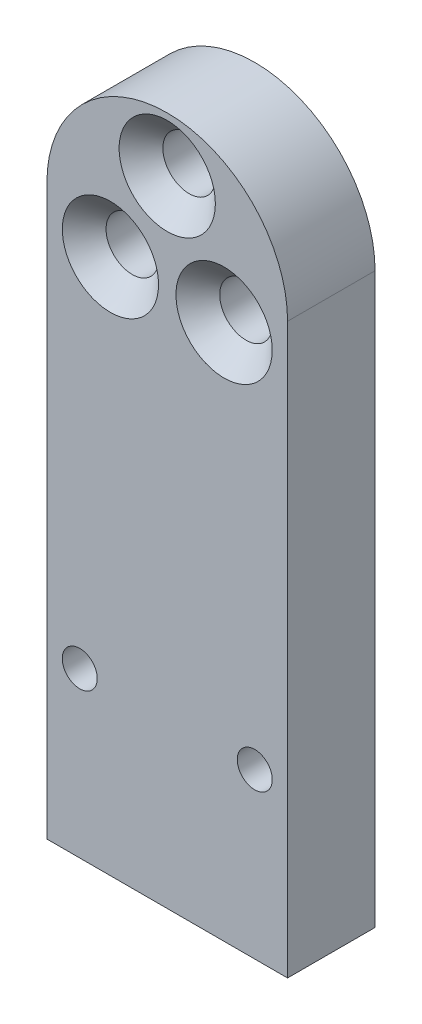
ISO-10303-21;
HEADER;
FILE_DESCRIPTION(('STEP AP214'),'2;1');
FILE_NAME('part.step','',(''),(''),'','','');
FILE_SCHEMA(('AUTOMOTIVE_DESIGN { 1 0 10303 214 1 1 1 1 }'));
ENDSEC;
DATA;
#1=APPLICATION_CONTEXT('core data for automotive mechanical design processes');
#2=APPLICATION_PROTOCOL_DEFINITION('international standard','automotive_design',2000,#1);
#3=PRODUCT_CONTEXT('',#1,'mechanical');
#4=PRODUCT('Part','Part','',(#3));
#5=PRODUCT_RELATED_PRODUCT_CATEGORY('part','',(#4));
#6=PRODUCT_DEFINITION_FORMATION('','',#4);
#7=PRODUCT_DEFINITION_CONTEXT('part definition',#1,'design');
#8=PRODUCT_DEFINITION('design','',#6,#7);
#9=PRODUCT_DEFINITION_SHAPE('','',#8);
#10=(LENGTH_UNIT() NAMED_UNIT(*) SI_UNIT(.MILLI.,.METRE.));
#11=(NAMED_UNIT(*) PLANE_ANGLE_UNIT() SI_UNIT($,.RADIAN.));
#12=(NAMED_UNIT(*) SI_UNIT($,.STERADIAN.) SOLID_ANGLE_UNIT());
#13=UNCERTAINTY_MEASURE_WITH_UNIT(LENGTH_MEASURE(1.E-05),#10,'distance_accuracy_value','');
#14=(GEOMETRIC_REPRESENTATION_CONTEXT(3) GLOBAL_UNCERTAINTY_ASSIGNED_CONTEXT((#13)) GLOBAL_UNIT_ASSIGNED_CONTEXT((#10,
#11,#12)) REPRESENTATION_CONTEXT('',''));
#15=CARTESIAN_POINT('',(0.,0.,0.));
#16=DIRECTION('',(0.,0.,1.));
#17=DIRECTION('',(1.,0.,0.));
#18=AXIS2_PLACEMENT_3D('',#15,#16,#17);
#19=CARTESIAN_POINT('',(0.,0.,4.));
#20=DIRECTION('',(0.,0.,-1.));
#21=DIRECTION('',(-1.,0.,0.));
#22=AXIS2_PLACEMENT_3D('',#19,#20,#21);
#23=CYLINDRICAL_SURFACE('',#22,5.5);
#24=CARTESIAN_POINT('',(0.,0.,0.));
#25=DIRECTION('',(0.,0.,1.));
#26=DIRECTION('',(1.,0.,0.));
#27=AXIS2_PLACEMENT_3D('',#24,#25,#26);
#28=CIRCLE('',#27,5.5);
#29=CARTESIAN_POINT('',(5.5,0.,0.));
#30=VERTEX_POINT('',#29);
#31=CARTESIAN_POINT('',(-5.5,0.,0.));
#32=VERTEX_POINT('',#31);
#33=EDGE_CURVE('E111',#30,#32,#28,.T.);
#34=ORIENTED_EDGE('',*,*,#33,.T.);
#35=DIRECTION('',(0.,0.,-1.));
#36=VECTOR('',#35,1.);
#37=CARTESIAN_POINT('',(-5.5,0.,4.));
#38=LINE('',#37,#36);
#39=CARTESIAN_POINT('',(-5.5,0.,4.));
#40=VERTEX_POINT('',#39);
#41=EDGE_CURVE('E11',#40,#32,#38,.T.);
#42=ORIENTED_EDGE('',*,*,#41,.F.);
#43=CARTESIAN_POINT('',(0.,0.,4.));
#44=DIRECTION('',(0.,0.,1.));
#45=DIRECTION('',(1.,0.,0.));
#46=AXIS2_PLACEMENT_3D('',#43,#44,#45);
#47=CIRCLE('',#46,5.5);
#48=CARTESIAN_POINT('',(5.5,0.,4.));
#49=VERTEX_POINT('',#48);
#50=EDGE_CURVE('E95',#49,#40,#47,.T.);
#51=ORIENTED_EDGE('',*,*,#50,.F.);
#52=DIRECTION('',(0.,0.,-1.));
#53=VECTOR('',#52,1.);
#54=CARTESIAN_POINT('',(5.5,0.,4.));
#55=LINE('',#54,#53);
#56=EDGE_CURVE('E107',#49,#30,#55,.T.);
#57=ORIENTED_EDGE('',*,*,#56,.T.);
#58=EDGE_LOOP('',(#34,#42,#51,#57));
#59=FACE_BOUND('',#58,.T.);
#60=ADVANCED_FACE('F43',(#59),#23,.T.);
#61=CARTESIAN_POINT('',(-5.5,0.,4.));
#62=DIRECTION('',(1.,0.,0.));
#63=DIRECTION('',(0.,1.,0.));
#64=AXIS2_PLACEMENT_3D('',#61,#62,#63);
#65=PLANE('',#64);
#66=DIRECTION('',(0.,-1.,0.));
#67=VECTOR('',#66,1.);
#68=CARTESIAN_POINT('',(-5.5,0.,0.));
#69=LINE('',#68,#67);
#70=CARTESIAN_POINT('',(-5.5,-26.,0.));
#71=VERTEX_POINT('',#70);
#72=EDGE_CURVE('E100',#32,#71,#69,.T.);
#73=ORIENTED_EDGE('',*,*,#72,.T.);
#74=DIRECTION('',(0.,0.,-1.));
#75=VECTOR('',#74,1.);
#76=CARTESIAN_POINT('',(-5.5,-26.,4.));
#77=LINE('',#76,#75);
#78=CARTESIAN_POINT('',(-5.5,-26.,4.));
#79=VERTEX_POINT('',#78);
#80=EDGE_CURVE('E52',#79,#71,#77,.T.);
#81=ORIENTED_EDGE('',*,*,#80,.F.);
#82=DIRECTION('',(0.,-1.,0.));
#83=VECTOR('',#82,1.);
#84=CARTESIAN_POINT('',(-5.5,0.,4.));
#85=LINE('',#84,#83);
#86=EDGE_CURVE('E90',#40,#79,#85,.T.);
#87=ORIENTED_EDGE('',*,*,#86,.F.);
#88=ORIENTED_EDGE('',*,*,#41,.T.);
#89=EDGE_LOOP('',(#73,#81,#87,#88));
#90=FACE_BOUND('',#89,.T.);
#91=ADVANCED_FACE('F99',(#90),#65,.F.);
#92=CARTESIAN_POINT('',(5.5,-26.,4.));
#93=DIRECTION('',(0.,1.,0.));
#94=DIRECTION('',(0.,0.,1.));
#95=AXIS2_PLACEMENT_3D('',#92,#93,#94);
#96=PLANE('',#95);
#97=DIRECTION('',(1.,0.,0.));
#98=VECTOR('',#97,1.);
#99=CARTESIAN_POINT('',(5.5,-26.,0.));
#100=LINE('',#99,#98);
#101=CARTESIAN_POINT('',(5.5,-26.,0.));
#102=VERTEX_POINT('',#101);
#103=EDGE_CURVE('E77',#71,#102,#100,.T.);
#104=ORIENTED_EDGE('',*,*,#103,.T.);
#105=DIRECTION('',(0.,0.,-1.));
#106=VECTOR('',#105,1.);
#107=CARTESIAN_POINT('',(5.5,-26.,4.));
#108=LINE('',#107,#106);
#109=CARTESIAN_POINT('',(5.5,-26.,4.));
#110=VERTEX_POINT('',#109);
#111=EDGE_CURVE('E102',#110,#102,#108,.T.);
#112=ORIENTED_EDGE('',*,*,#111,.F.);
#113=DIRECTION('',(1.,0.,0.));
#114=VECTOR('',#113,1.);
#115=CARTESIAN_POINT('',(5.5,-26.,4.));
#116=LINE('',#115,#114);
#117=EDGE_CURVE('E93',#79,#110,#116,.T.);
#118=ORIENTED_EDGE('',*,*,#117,.F.);
#119=ORIENTED_EDGE('',*,*,#80,.T.);
#120=EDGE_LOOP('',(#104,#112,#118,#119));
#121=FACE_BOUND('',#120,.T.);
#122=ADVANCED_FACE('F103',(#121),#96,.F.);
#123=CARTESIAN_POINT('',(5.5,0.,4.));
#124=DIRECTION('',(-1.,0.,0.));
#125=DIRECTION('',(0.,-1.,0.));
#126=AXIS2_PLACEMENT_3D('',#123,#124,#125);
#127=PLANE('',#126);
#128=DIRECTION('',(0.,1.,0.));
#129=VECTOR('',#128,1.);
#130=CARTESIAN_POINT('',(5.5,0.,0.));
#131=LINE('',#130,#129);
#132=EDGE_CURVE('E83',#102,#30,#131,.T.);
#133=ORIENTED_EDGE('',*,*,#132,.T.);
#134=ORIENTED_EDGE('',*,*,#56,.F.);
#135=DIRECTION('',(0.,1.,0.));
#136=VECTOR('',#135,1.);
#137=CARTESIAN_POINT('',(5.5,0.,4.));
#138=LINE('',#137,#136);
#139=EDGE_CURVE('E60',#110,#49,#138,.T.);
#140=ORIENTED_EDGE('',*,*,#139,.F.);
#141=ORIENTED_EDGE('',*,*,#111,.T.);
#142=EDGE_LOOP('',(#133,#134,#140,#141));
#143=FACE_BOUND('',#142,.T.);
#144=ADVANCED_FACE('F125',(#143),#127,.F.);
#145=CARTESIAN_POINT('',(0.,0.,4.));
#146=DIRECTION('',(0.,0.,1.));
#147=DIRECTION('',(1.,0.,0.));
#148=AXIS2_PLACEMENT_3D('',#145,#146,#147);
#149=PLANE('',#148);
#150=CARTESIAN_POINT('',(2.59807621135333,-1.49999999999998,4.));
#151=DIRECTION('',(0.,0.,1.));
#152=DIRECTION('',(1.,0.,0.));
#153=AXIS2_PLACEMENT_3D('',#150,#151,#152);
#154=CIRCLE('',#153,2.2);
#155=CARTESIAN_POINT('',(4.79807621135333,-1.49999999999998,4.));
#156=VERTEX_POINT('',#155);
#157=EDGE_CURVE('E179',#156,#156,#154,.T.);
#158=ORIENTED_EDGE('',*,*,#157,.F.);
#159=EDGE_LOOP('',(#158));
#160=FACE_BOUND('',#159,.T.);
#161=CARTESIAN_POINT('',(-2.59807621135331,-1.50000000000001,4.));
#162=DIRECTION('',(0.,0.,1.));
#163=DIRECTION('',(1.,0.,0.));
#164=AXIS2_PLACEMENT_3D('',#161,#162,#163);
#165=CIRCLE('',#164,2.2);
#166=CARTESIAN_POINT('',(-0.398076211353309,-1.50000000000001,4.));
#167=VERTEX_POINT('',#166);
#168=EDGE_CURVE('E167',#167,#167,#165,.T.);
#169=ORIENTED_EDGE('',*,*,#168,.F.);
#170=EDGE_LOOP('',(#169));
#171=FACE_BOUND('',#170,.T.);
#172=CARTESIAN_POINT('',(0.,3.,4.));
#173=DIRECTION('',(0.,0.,1.));
#174=DIRECTION('',(1.,0.,0.));
#175=AXIS2_PLACEMENT_3D('',#172,#173,#174);
#176=CIRCLE('',#175,2.2);
#177=CARTESIAN_POINT('',(2.2,3.,4.));
#178=VERTEX_POINT('',#177);
#179=EDGE_CURVE('E155',#178,#178,#176,.T.);
#180=ORIENTED_EDGE('',*,*,#179,.F.);
#181=EDGE_LOOP('',(#180));
#182=FACE_BOUND('',#181,.T.);
#183=CARTESIAN_POINT('',(-4.,-18.5,4.));
#184=DIRECTION('',(0.,0.,1.));
#185=DIRECTION('',(1.,0.,0.));
#186=AXIS2_PLACEMENT_3D('',#183,#184,#185);
#187=CIRCLE('',#186,0.799999999999999);
#188=CARTESIAN_POINT('',(-3.2,-18.5,4.));
#189=VERTEX_POINT('',#188);
#190=EDGE_CURVE('E143',#189,#189,#187,.T.);
#191=ORIENTED_EDGE('',*,*,#190,.F.);
#192=EDGE_LOOP('',(#191));
#193=FACE_BOUND('',#192,.T.);
#194=CARTESIAN_POINT('',(4.,-18.5,4.));
#195=DIRECTION('',(0.,0.,1.));
#196=DIRECTION('',(1.,0.,0.));
#197=AXIS2_PLACEMENT_3D('',#194,#195,#196);
#198=CIRCLE('',#197,0.799999999999999);
#199=CARTESIAN_POINT('',(4.8,-18.5,4.));
#200=VERTEX_POINT('',#199);
#201=EDGE_CURVE('E135',#200,#200,#198,.T.);
#202=ORIENTED_EDGE('',*,*,#201,.F.);
#203=EDGE_LOOP('',(#202));
#204=FACE_BOUND('',#203,.T.);
#205=ORIENTED_EDGE('',*,*,#50,.T.);
#206=ORIENTED_EDGE('',*,*,#86,.T.);
#207=ORIENTED_EDGE('',*,*,#117,.T.);
#208=ORIENTED_EDGE('',*,*,#139,.T.);
#209=EDGE_LOOP('',(#205,#206,#207,#208));
#210=FACE_BOUND('',#209,.T.);
#211=ADVANCED_FACE('F91',(#160,#171,#182,#193,#204,#210),#149,.T.);
#212=CARTESIAN_POINT('',(0.,0.,0.));
#213=DIRECTION('',(0.,0.,1.));
#214=DIRECTION('',(1.,0.,0.));
#215=AXIS2_PLACEMENT_3D('',#212,#213,#214);
#216=PLANE('',#215);
#217=CARTESIAN_POINT('',(2.59807621135333,-1.49999999999998,0.));
#218=DIRECTION('',(0.,0.,1.));
#219=DIRECTION('',(1.,0.,0.));
#220=AXIS2_PLACEMENT_3D('',#217,#218,#219);
#221=CIRCLE('',#220,1.2);
#222=CARTESIAN_POINT('',(3.79807621135333,-1.49999999999998,0.));
#223=VERTEX_POINT('',#222);
#224=EDGE_CURVE('E171',#223,#223,#221,.T.);
#225=ORIENTED_EDGE('',*,*,#224,.T.);
#226=EDGE_LOOP('',(#225));
#227=FACE_BOUND('',#226,.T.);
#228=CARTESIAN_POINT('',(-2.59807621135331,-1.50000000000001,0.));
#229=DIRECTION('',(0.,0.,1.));
#230=DIRECTION('',(1.,0.,0.));
#231=AXIS2_PLACEMENT_3D('',#228,#229,#230);
#232=CIRCLE('',#231,1.2);
#233=CARTESIAN_POINT('',(-1.39807621135331,-1.50000000000001,0.));
#234=VERTEX_POINT('',#233);
#235=EDGE_CURVE('E159',#234,#234,#232,.T.);
#236=ORIENTED_EDGE('',*,*,#235,.T.);
#237=EDGE_LOOP('',(#236));
#238=FACE_BOUND('',#237,.T.);
#239=CARTESIAN_POINT('',(0.,3.,0.));
#240=DIRECTION('',(0.,0.,1.));
#241=DIRECTION('',(1.,0.,0.));
#242=AXIS2_PLACEMENT_3D('',#239,#240,#241);
#243=CIRCLE('',#242,1.2);
#244=CARTESIAN_POINT('',(1.2,3.,0.));
#245=VERTEX_POINT('',#244);
#246=EDGE_CURVE('E147',#245,#245,#243,.T.);
#247=ORIENTED_EDGE('',*,*,#246,.T.);
#248=EDGE_LOOP('',(#247));
#249=FACE_BOUND('',#248,.T.);
#250=CARTESIAN_POINT('',(-4.,-18.5,0.));
#251=DIRECTION('',(0.,0.,1.));
#252=DIRECTION('',(1.,0.,0.));
#253=AXIS2_PLACEMENT_3D('',#250,#251,#252);
#254=CIRCLE('',#253,0.799999999999999);
#255=CARTESIAN_POINT('',(-3.2,-18.5,0.));
#256=VERTEX_POINT('',#255);
#257=EDGE_CURVE('E139',#256,#256,#254,.T.);
#258=ORIENTED_EDGE('',*,*,#257,.T.);
#259=EDGE_LOOP('',(#258));
#260=FACE_BOUND('',#259,.T.);
#261=CARTESIAN_POINT('',(4.,-18.5,0.));
#262=DIRECTION('',(0.,0.,1.));
#263=DIRECTION('',(1.,0.,0.));
#264=AXIS2_PLACEMENT_3D('',#261,#262,#263);
#265=CIRCLE('',#264,0.799999999999999);
#266=CARTESIAN_POINT('',(4.8,-18.5,0.));
#267=VERTEX_POINT('',#266);
#268=EDGE_CURVE('E115',#267,#267,#265,.T.);
#269=ORIENTED_EDGE('',*,*,#268,.T.);
#270=EDGE_LOOP('',(#269));
#271=FACE_BOUND('',#270,.T.);
#272=ORIENTED_EDGE('',*,*,#33,.F.);
#273=ORIENTED_EDGE('',*,*,#132,.F.);
#274=ORIENTED_EDGE('',*,*,#103,.F.);
#275=ORIENTED_EDGE('',*,*,#72,.F.);
#276=EDGE_LOOP('',(#272,#273,#274,#275));
#277=FACE_BOUND('',#276,.T.);
#278=ADVANCED_FACE('F128',(#227,#238,#249,#260,#271,#277),#216,.F.);
#279=CARTESIAN_POINT('',(4.,-18.5,4.));
#280=DIRECTION('',(0.,0.,1.));
#281=DIRECTION('',(1.,0.,0.));
#282=AXIS2_PLACEMENT_3D('',#279,#280,#281);
#283=CYLINDRICAL_SURFACE('',#282,0.799999999999999);
#284=ORIENTED_EDGE('',*,*,#268,.F.);
#285=EDGE_LOOP('',(#284));
#286=FACE_BOUND('',#285,.T.);
#287=ORIENTED_EDGE('',*,*,#201,.T.);
#288=EDGE_LOOP('',(#287));
#289=FACE_BOUND('',#288,.T.);
#290=ADVANCED_FACE('F197',(#286,#289),#283,.F.);
#291=CARTESIAN_POINT('',(-4.,-18.5,4.));
#292=DIRECTION('',(0.,0.,1.));
#293=DIRECTION('',(1.,0.,0.));
#294=AXIS2_PLACEMENT_3D('',#291,#292,#293);
#295=CYLINDRICAL_SURFACE('',#294,0.799999999999999);
#296=ORIENTED_EDGE('',*,*,#257,.F.);
#297=EDGE_LOOP('',(#296));
#298=FACE_BOUND('',#297,.T.);
#299=ORIENTED_EDGE('',*,*,#190,.T.);
#300=EDGE_LOOP('',(#299));
#301=FACE_BOUND('',#300,.T.);
#302=ADVANCED_FACE('F199',(#298,#301),#295,.F.);
#303=CARTESIAN_POINT('',(0.,3.,4.));
#304=DIRECTION('',(0.,0.,1.));
#305=DIRECTION('',(1.,0.,0.));
#306=AXIS2_PLACEMENT_3D('',#303,#304,#305);
#307=CYLINDRICAL_SURFACE('',#306,1.2);
#308=ORIENTED_EDGE('',*,*,#246,.F.);
#309=EDGE_LOOP('',(#308));
#310=FACE_BOUND('',#309,.T.);
#311=CARTESIAN_POINT('',(0.,3.,3.));
#312=DIRECTION('',(0.,0.,1.));
#313=DIRECTION('',(1.,0.,0.));
#314=AXIS2_PLACEMENT_3D('',#311,#312,#313);
#315=CIRCLE('',#314,1.2);
#316=CARTESIAN_POINT('',(1.2,3.,3.));
#317=VERTEX_POINT('',#316);
#318=EDGE_CURVE('E151',#317,#317,#315,.T.);
#319=ORIENTED_EDGE('',*,*,#318,.T.);
#320=EDGE_LOOP('',(#319));
#321=FACE_BOUND('',#320,.T.);
#322=ADVANCED_FACE('F206',(#310,#321),#307,.F.);
#323=CARTESIAN_POINT('',(0.,3.,4.));
#324=DIRECTION('',(0.,0.,1.));
#325=DIRECTION('',(1.,0.,0.));
#326=AXIS2_PLACEMENT_3D('',#323,#324,#325);
#327=CONICAL_SURFACE('',#326,2.2,0.785398163397448);
#328=ORIENTED_EDGE('',*,*,#318,.F.);
#329=EDGE_LOOP('',(#328));
#330=FACE_BOUND('',#329,.T.);
#331=ORIENTED_EDGE('',*,*,#179,.T.);
#332=EDGE_LOOP('',(#331));
#333=FACE_BOUND('',#332,.T.);
#334=ADVANCED_FACE('F249',(#330,#333),#327,.F.);
#335=CARTESIAN_POINT('',(-2.59807621135331,-1.50000000000001,4.));
#336=DIRECTION('',(0.,0.,1.));
#337=DIRECTION('',(1.,0.,0.));
#338=AXIS2_PLACEMENT_3D('',#335,#336,#337);
#339=CYLINDRICAL_SURFACE('',#338,1.2);
#340=ORIENTED_EDGE('',*,*,#235,.F.);
#341=EDGE_LOOP('',(#340));
#342=FACE_BOUND('',#341,.T.);
#343=CARTESIAN_POINT('',(-2.59807621135331,-1.50000000000001,3.));
#344=DIRECTION('',(0.,0.,1.));
#345=DIRECTION('',(1.,0.,0.));
#346=AXIS2_PLACEMENT_3D('',#343,#344,#345);
#347=CIRCLE('',#346,1.2);
#348=CARTESIAN_POINT('',(-1.39807621135331,-1.50000000000001,3.));
#349=VERTEX_POINT('',#348);
#350=EDGE_CURVE('E163',#349,#349,#347,.T.);
#351=ORIENTED_EDGE('',*,*,#350,.T.);
#352=EDGE_LOOP('',(#351));
#353=FACE_BOUND('',#352,.T.);
#354=ADVANCED_FACE('F243',(#342,#353),#339,.F.);
#355=CARTESIAN_POINT('',(-2.59807621135331,-1.50000000000001,4.));
#356=DIRECTION('',(0.,0.,1.));
#357=DIRECTION('',(1.,0.,0.));
#358=AXIS2_PLACEMENT_3D('',#355,#356,#357);
#359=CONICAL_SURFACE('',#358,2.2,0.785398163397448);
#360=ORIENTED_EDGE('',*,*,#350,.F.);
#361=EDGE_LOOP('',(#360));
#362=FACE_BOUND('',#361,.T.);
#363=ORIENTED_EDGE('',*,*,#168,.T.);
#364=EDGE_LOOP('',(#363));
#365=FACE_BOUND('',#364,.T.);
#366=ADVANCED_FACE('F248',(#362,#365),#359,.F.);
#367=CARTESIAN_POINT('',(2.59807621135333,-1.49999999999998,4.));
#368=DIRECTION('',(0.,0.,1.));
#369=DIRECTION('',(1.,0.,0.));
#370=AXIS2_PLACEMENT_3D('',#367,#368,#369);
#371=CYLINDRICAL_SURFACE('',#370,1.2);
#372=ORIENTED_EDGE('',*,*,#224,.F.);
#373=EDGE_LOOP('',(#372));
#374=FACE_BOUND('',#373,.T.);
#375=CARTESIAN_POINT('',(2.59807621135333,-1.49999999999998,3.));
#376=DIRECTION('',(0.,0.,1.));
#377=DIRECTION('',(1.,0.,0.));
#378=AXIS2_PLACEMENT_3D('',#375,#376,#377);
#379=CIRCLE('',#378,1.2);
#380=CARTESIAN_POINT('',(3.79807621135333,-1.49999999999998,3.));
#381=VERTEX_POINT('',#380);
#382=EDGE_CURVE('E175',#381,#381,#379,.T.);
#383=ORIENTED_EDGE('',*,*,#382,.T.);
#384=EDGE_LOOP('',(#383));
#385=FACE_BOUND('',#384,.T.);
#386=ADVANCED_FACE('F261',(#374,#385),#371,.F.);
#387=CARTESIAN_POINT('',(2.59807621135333,-1.49999999999998,4.));
#388=DIRECTION('',(0.,0.,1.));
#389=DIRECTION('',(1.,0.,0.));
#390=AXIS2_PLACEMENT_3D('',#387,#388,#389);
#391=CONICAL_SURFACE('',#390,2.2,0.785398163397449);
#392=ORIENTED_EDGE('',*,*,#382,.F.);
#393=EDGE_LOOP('',(#392));
#394=FACE_BOUND('',#393,.T.);
#395=ORIENTED_EDGE('',*,*,#157,.T.);
#396=EDGE_LOOP('',(#395));
#397=FACE_BOUND('',#396,.T.);
#398=ADVANCED_FACE('F184',(#394,#397),#391,.F.);
#399=CLOSED_SHELL('',(#60,#91,#122,#144,#211,#278,#290,#302,#322,#334,#354,#366,#386,#398));
#400=MANIFOLD_SOLID_BREP('B2',#399);
#401=ADVANCED_BREP_SHAPE_REPRESENTATION('',(#18,#400),#14);
#402=SHAPE_DEFINITION_REPRESENTATION(#9,#401);
ENDSEC;
END-ISO-10303-21;
